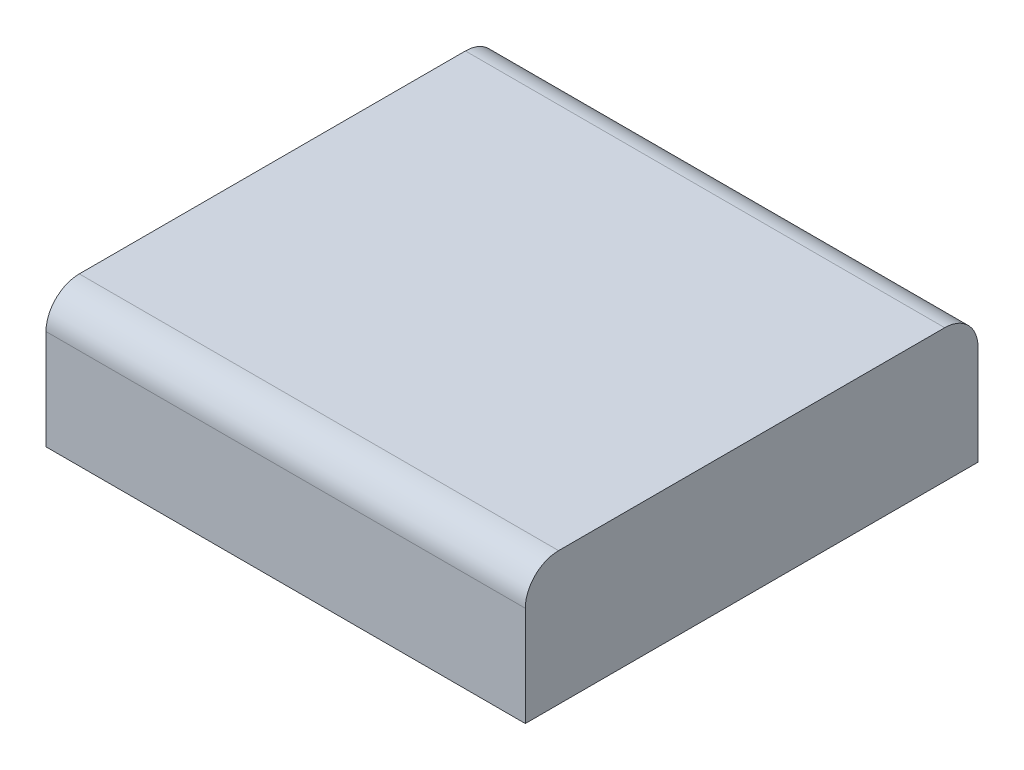
ISO-10303-21;
HEADER;
FILE_DESCRIPTION(('STEP AP214'),'2;1');
FILE_NAME('part.step','',(''),(''),'','','');
FILE_SCHEMA(('AUTOMOTIVE_DESIGN { 1 0 10303 214 1 1 1 1 }'));
ENDSEC;
DATA;
#1=APPLICATION_CONTEXT('core data for automotive mechanical design processes');
#2=APPLICATION_PROTOCOL_DEFINITION('international standard','automotive_design',2000,#1);
#3=PRODUCT_CONTEXT('',#1,'mechanical');
#4=PRODUCT('Part','Part','',(#3));
#5=PRODUCT_RELATED_PRODUCT_CATEGORY('part','',(#4));
#6=PRODUCT_DEFINITION_FORMATION('','',#4);
#7=PRODUCT_DEFINITION_CONTEXT('part definition',#1,'design');
#8=PRODUCT_DEFINITION('design','',#6,#7);
#9=PRODUCT_DEFINITION_SHAPE('','',#8);
#10=(LENGTH_UNIT() NAMED_UNIT(*) SI_UNIT(.MILLI.,.METRE.));
#11=(NAMED_UNIT(*) PLANE_ANGLE_UNIT() SI_UNIT($,.RADIAN.));
#12=(NAMED_UNIT(*) SI_UNIT($,.STERADIAN.) SOLID_ANGLE_UNIT());
#13=UNCERTAINTY_MEASURE_WITH_UNIT(LENGTH_MEASURE(1.E-05),#10,'distance_accuracy_value','');
#14=(GEOMETRIC_REPRESENTATION_CONTEXT(3) GLOBAL_UNCERTAINTY_ASSIGNED_CONTEXT((#13)) GLOBAL_UNIT_ASSIGNED_CONTEXT((#10,
#11,#12)) REPRESENTATION_CONTEXT('',''));
#15=CARTESIAN_POINT('',(0.,0.,0.));
#16=DIRECTION('',(0.,0.,1.));
#17=DIRECTION('',(1.,0.,0.));
#18=AXIS2_PLACEMENT_3D('',#15,#16,#17);
#19=CARTESIAN_POINT('',(17.,-5.,34.));
#20=DIRECTION('',(-1.,0.,0.));
#21=DIRECTION('',(0.,0.,1.));
#22=AXIS2_PLACEMENT_3D('',#19,#20,#21);
#23=PLANE('',#22);
#24=DIRECTION('',(0.,0.,1.));
#25=VECTOR('',#24,1.);
#26=CARTESIAN_POINT('',(17.,-3.59856596328812,34.));
#27=LINE('',#26,#25);
#28=CARTESIAN_POINT('',(17.,-3.59856596328812,22.7934089247413));
#29=VERTEX_POINT('',#28);
#30=CARTESIAN_POINT('',(17.,-3.59856596328812,30.8818924935145));
#31=VERTEX_POINT('',#30);
#32=EDGE_CURVE('E549',#29,#31,#27,.T.);
#33=ORIENTED_EDGE('',*,*,#32,.T.);
#34=DIRECTION('',(0.,-1.,0.));
#35=VECTOR('',#34,1.);
#36=CARTESIAN_POINT('',(17.,-5.,30.8818924935145));
#37=LINE('',#36,#35);
#38=CARTESIAN_POINT('',(17.,-5.,30.8818924935145));
#39=VERTEX_POINT('',#38);
#40=EDGE_CURVE('E293',#31,#39,#37,.T.);
#41=ORIENTED_EDGE('',*,*,#40,.T.);
#42=DIRECTION('',(0.,0.,-1.));
#43=VECTOR('',#42,1.);
#44=CARTESIAN_POINT('',(17.,-5.,34.));
#45=LINE('',#44,#43);
#46=CARTESIAN_POINT('',(17.,-5.,33.));
#47=VERTEX_POINT('',#46);
#48=EDGE_CURVE('E452',#47,#39,#45,.T.);
#49=ORIENTED_EDGE('',*,*,#48,.F.);
#50=DIRECTION('',(0.,1.,0.));
#51=VECTOR('',#50,1.);
#52=CARTESIAN_POINT('',(17.,-5.,33.));
#53=LINE('',#52,#51);
#54=CARTESIAN_POINT('',(17.,4.,33.));
#55=VERTEX_POINT('',#54);
#56=EDGE_CURVE('E429',#47,#55,#53,.T.);
#57=ORIENTED_EDGE('',*,*,#56,.T.);
#58=DIRECTION('',(0.,0.,-1.));
#59=VECTOR('',#58,1.);
#60=CARTESIAN_POINT('',(17.,4.,34.));
#61=LINE('',#60,#59);
#62=CARTESIAN_POINT('',(17.,4.,28.926894451086));
#63=VERTEX_POINT('',#62);
#64=EDGE_CURVE('E431',#55,#63,#61,.T.);
#65=ORIENTED_EDGE('',*,*,#64,.T.);
#66=DIRECTION('',(0.,-1.,0.));
#67=VECTOR('',#66,1.);
#68=CARTESIAN_POINT('',(17.,-5.,28.926894451086));
#69=LINE('',#68,#67);
#70=CARTESIAN_POINT('',(17.,-1.05643277440728,28.926894451086));
#71=VERTEX_POINT('',#70);
#72=EDGE_CURVE('E490',#63,#71,#69,.T.);
#73=ORIENTED_EDGE('',*,*,#72,.T.);
#74=DIRECTION('',(0.,0.,-1.));
#75=VECTOR('',#74,1.);
#76=CARTESIAN_POINT('',(17.,-1.05643277440728,34.));
#77=LINE('',#76,#75);
#78=CARTESIAN_POINT('',(17.,-1.05643277440728,4.95785802597595));
#79=VERTEX_POINT('',#78);
#80=EDGE_CURVE('E487',#71,#79,#77,.T.);
#81=ORIENTED_EDGE('',*,*,#80,.T.);
#82=DIRECTION('',(0.,1.,0.));
#83=VECTOR('',#82,1.);
#84=CARTESIAN_POINT('',(17.,-5.,4.95785802597595));
#85=LINE('',#84,#83);
#86=CARTESIAN_POINT('',(17.,4.,4.95785802597595));
#87=VERTEX_POINT('',#86);
#88=EDGE_CURVE('E477',#79,#87,#85,.T.);
#89=ORIENTED_EDGE('',*,*,#88,.T.);
#90=CARTESIAN_POINT('',(17.,4.,1.));
#91=VERTEX_POINT('',#90);
#92=EDGE_CURVE('E435',#87,#91,#61,.T.);
#93=ORIENTED_EDGE('',*,*,#92,.T.);
#94=DIRECTION('',(0.,1.,0.));
#95=VECTOR('',#94,1.);
#96=CARTESIAN_POINT('',(17.,-5.,1.));
#97=LINE('',#96,#95);
#98=CARTESIAN_POINT('',(17.,-5.,1.));
#99=VERTEX_POINT('',#98);
#100=EDGE_CURVE('E420',#99,#91,#97,.T.);
#101=ORIENTED_EDGE('',*,*,#100,.F.);
#102=CARTESIAN_POINT('',(17.,-5.,22.7934089247413));
#103=VERTEX_POINT('',#102);
#104=EDGE_CURVE('E434',#103,#99,#45,.T.);
#105=ORIENTED_EDGE('',*,*,#104,.F.);
#106=DIRECTION('',(0.,1.,0.));
#107=VECTOR('',#106,1.);
#108=CARTESIAN_POINT('',(17.,-5.,22.7934089247413));
#109=LINE('',#108,#107);
#110=EDGE_CURVE('E289',#103,#29,#109,.T.);
#111=ORIENTED_EDGE('',*,*,#110,.T.);
#112=EDGE_LOOP('',(#33,#41,#49,#57,#65,#73,#81,#89,#93,#101,#105,#111));
#113=FACE_BOUND('',#112,.T.);
#114=ADVANCED_FACE('F39',(#113),#23,.T.);
#115=CARTESIAN_POINT('',(-18.,-5.,34.));
#116=DIRECTION('',(0.,1.,0.));
#117=DIRECTION('',(0.,0.,1.));
#118=AXIS2_PLACEMENT_3D('',#115,#116,#117);
#119=PLANE('',#118);
#120=DIRECTION('',(1.,0.,0.));
#121=VECTOR('',#120,1.);
#122=CARTESIAN_POINT('',(-18.,-5.,0.));
#123=LINE('',#122,#121);
#124=CARTESIAN_POINT('',(-18.,-5.,0.));
#125=VERTEX_POINT('',#124);
#126=CARTESIAN_POINT('',(18.,-5.,0.));
#127=VERTEX_POINT('',#126);
#128=EDGE_CURVE('E470',#125,#127,#123,.T.);
#129=ORIENTED_EDGE('',*,*,#128,.T.);
#130=DIRECTION('',(0.,0.,-1.));
#131=VECTOR('',#130,1.);
#132=CARTESIAN_POINT('',(18.,-5.,34.));
#133=LINE('',#132,#131);
#134=CARTESIAN_POINT('',(18.,-5.,34.));
#135=VERTEX_POINT('',#134);
#136=EDGE_CURVE('E480',#135,#127,#133,.T.);
#137=ORIENTED_EDGE('',*,*,#136,.F.);
#138=DIRECTION('',(1.,0.,0.));
#139=VECTOR('',#138,1.);
#140=CARTESIAN_POINT('',(-18.,-5.,34.));
#141=LINE('',#140,#139);
#142=CARTESIAN_POINT('',(-18.,-5.,34.));
#143=VERTEX_POINT('',#142);
#144=EDGE_CURVE('E461',#143,#135,#141,.T.);
#145=ORIENTED_EDGE('',*,*,#144,.F.);
#146=DIRECTION('',(0.,0.,-1.));
#147=VECTOR('',#146,1.);
#148=CARTESIAN_POINT('',(-18.,-5.,34.));
#149=LINE('',#148,#147);
#150=EDGE_CURVE('E478',#143,#125,#149,.T.);
#151=ORIENTED_EDGE('',*,*,#150,.T.);
#152=EDGE_LOOP('',(#129,#137,#145,#151));
#153=FACE_BOUND('',#152,.T.);
#154=DIRECTION('',(-1.,0.,0.));
#155=VECTOR('',#154,1.);
#156=CARTESIAN_POINT('',(-18.,-5.,30.8818924935145));
#157=LINE('',#156,#155);
#158=CARTESIAN_POINT('',(17.5,-5.,30.8818924935145));
#159=VERTEX_POINT('',#158);
#160=EDGE_CURVE('E11',#159,#39,#157,.T.);
#161=ORIENTED_EDGE('',*,*,#160,.F.);
#162=DIRECTION('',(0.,0.,-1.));
#163=VECTOR('',#162,1.);
#164=CARTESIAN_POINT('',(17.5,-5.,34.));
#165=LINE('',#164,#163);
#166=CARTESIAN_POINT('',(17.5,-5.,22.7934089247413));
#167=VERTEX_POINT('',#166);
#168=EDGE_CURVE('E276',#159,#167,#165,.T.);
#169=ORIENTED_EDGE('',*,*,#168,.T.);
#170=DIRECTION('',(1.,0.,0.));
#171=VECTOR('',#170,1.);
#172=CARTESIAN_POINT('',(-18.,-5.,22.7934089247413));
#173=LINE('',#172,#171);
#174=EDGE_CURVE('E47',#103,#167,#173,.T.);
#175=ORIENTED_EDGE('',*,*,#174,.F.);
#176=ORIENTED_EDGE('',*,*,#104,.T.);
#177=DIRECTION('',(1.,0.,0.));
#178=VECTOR('',#177,1.);
#179=CARTESIAN_POINT('',(-18.,-5.,1.));
#180=LINE('',#179,#178);
#181=CARTESIAN_POINT('',(-0.0461280866638075,-5.,1.));
#182=VERTEX_POINT('',#181);
#183=EDGE_CURVE('E449',#182,#99,#180,.T.);
#184=ORIENTED_EDGE('',*,*,#183,.F.);
#185=DIRECTION('',(-0.78437618023216,0.,0.620285424530035));
#186=VECTOR('',#185,1.);
#187=CARTESIAN_POINT('',(-1.2576755346504,-5.,1.95809286672909));
#188=LINE('',#187,#186);
#189=CARTESIAN_POINT('',(-1.2576755346504,-5.,1.95809286672909));
#190=VERTEX_POINT('',#189);
#191=EDGE_CURVE('E297',#182,#190,#188,.T.);
#192=ORIENTED_EDGE('',*,*,#191,.T.);
#193=DIRECTION('',(-1.,0.,0.));
#194=VECTOR('',#193,1.);
#195=CARTESIAN_POINT('',(-2.2990755346504,-5.,1.95809286672909));
#196=LINE('',#195,#194);
#197=CARTESIAN_POINT('',(-2.2990755346504,-5.,1.95809286672909));
#198=VERTEX_POINT('',#197);
#199=EDGE_CURVE('E294',#190,#198,#196,.T.);
#200=ORIENTED_EDGE('',*,*,#199,.T.);
#201=DIRECTION('',(-0.68997566103992,0.,-0.723832568466303));
#202=VECTOR('',#201,1.);
#203=CARTESIAN_POINT('',(-3.2123540853237,-5.,0.999999999999999));
#204=LINE('',#203,#202);
#205=CARTESIAN_POINT('',(-3.2123540853237,-5.,1.));
#206=VERTEX_POINT('',#205);
#207=EDGE_CURVE('E304',#198,#206,#204,.T.);
#208=ORIENTED_EDGE('',*,*,#207,.T.);
#209=CARTESIAN_POINT('',(-17.,-5.,1.));
#210=VERTEX_POINT('',#209);
#211=EDGE_CURVE('E439',#210,#206,#180,.T.);
#212=ORIENTED_EDGE('',*,*,#211,.F.);
#213=DIRECTION('',(0.,0.,-1.));
#214=VECTOR('',#213,1.);
#215=CARTESIAN_POINT('',(-17.,-5.,34.));
#216=LINE('',#215,#214);
#217=CARTESIAN_POINT('',(-17.,-5.,33.));
#218=VERTEX_POINT('',#217);
#219=EDGE_CURVE('E450',#218,#210,#216,.T.);
#220=ORIENTED_EDGE('',*,*,#219,.F.);
#221=DIRECTION('',(1.,0.,0.));
#222=VECTOR('',#221,1.);
#223=CARTESIAN_POINT('',(-18.,-5.,33.));
#224=LINE('',#223,#222);
#225=CARTESIAN_POINT('',(7.80627689891057,-5.,33.));
#226=VERTEX_POINT('',#225);
#227=EDGE_CURVE('E443',#218,#226,#224,.T.);
#228=ORIENTED_EDGE('',*,*,#227,.T.);
#229=DIRECTION('',(0.707040858821482,0.,-0.707172697406356));
#230=VECTOR('',#229,1.);
#231=CARTESIAN_POINT('',(7.80627689891058,-5.,33.));
#232=LINE('',#231,#230);
#233=CARTESIAN_POINT('',(8.86878502896893,-5.,31.9372937490459));
#234=VERTEX_POINT('',#233);
#235=EDGE_CURVE('E318',#226,#234,#232,.T.);
#236=ORIENTED_EDGE('',*,*,#235,.T.);
#237=DIRECTION('',(1.,0.,0.));
#238=VECTOR('',#237,1.);
#239=CARTESIAN_POINT('',(8.86878502896893,-5.,31.9372937490459));
#240=LINE('',#239,#238);
#241=CARTESIAN_POINT('',(11.5237850289689,-5.,31.9372937490459));
#242=VERTEX_POINT('',#241);
#243=EDGE_CURVE('E314',#234,#242,#240,.T.);
#244=ORIENTED_EDGE('',*,*,#243,.T.);
#245=DIRECTION('',(0.,0.,1.));
#246=VECTOR('',#245,1.);
#247=CARTESIAN_POINT('',(11.5237850289689,-5.,31.9372937490459));
#248=LINE('',#247,#246);
#249=CARTESIAN_POINT('',(11.5237850289689,-5.,33.));
#250=VERTEX_POINT('',#249);
#251=EDGE_CURVE('E321',#242,#250,#248,.T.);
#252=ORIENTED_EDGE('',*,*,#251,.T.);
#253=EDGE_CURVE('E446',#250,#47,#224,.T.);
#254=ORIENTED_EDGE('',*,*,#253,.T.);
#255=ORIENTED_EDGE('',*,*,#48,.T.);
#256=EDGE_LOOP('',(#161,#169,#175,#176,#184,#192,#200,#208,#212,#220,#228,#236,#244,#252,#254,#255));
#257=FACE_BOUND('',#256,.T.);
#258=ADVANCED_FACE('F545',(#153,#257),#119,.F.);
#259=CARTESIAN_POINT('',(0.,0.,1.));
#260=DIRECTION('',(0.,0.,1.));
#261=DIRECTION('',(1.,0.,0.));
#262=AXIS2_PLACEMENT_3D('',#259,#260,#261);
#263=PLANE('',#262);
#264=ORIENTED_EDGE('',*,*,#211,.T.);
#265=DIRECTION('',(0.,-1.,0.));
#266=VECTOR('',#265,1.);
#267=CARTESIAN_POINT('',(-3.2123540853237,7.86642099012341,0.999999999999999));
#268=LINE('',#267,#266);
#269=CARTESIAN_POINT('',(-3.2123540853237,-3.2,1.));
#270=VERTEX_POINT('',#269);
#271=EDGE_CURVE('E307',#270,#206,#268,.T.);
#272=ORIENTED_EDGE('',*,*,#271,.F.);
#273=DIRECTION('',(-1.,0.,0.));
#274=VECTOR('',#273,1.);
#275=CARTESIAN_POINT('',(0.,-3.2,1.));
#276=LINE('',#275,#274);
#277=CARTESIAN_POINT('',(-5.64547851523037,-3.2,1.));
#278=VERTEX_POINT('',#277);
#279=EDGE_CURVE('E503',#270,#278,#276,.T.);
#280=ORIENTED_EDGE('',*,*,#279,.T.);
#281=DIRECTION('',(0.,-1.,0.));
#282=VECTOR('',#281,1.);
#283=CARTESIAN_POINT('',(-5.64547851523037,0.,1.));
#284=LINE('',#283,#282);
#285=CARTESIAN_POINT('',(-5.64547851523037,4.,1.));
#286=VERTEX_POINT('',#285);
#287=EDGE_CURVE('E506',#286,#278,#284,.T.);
#288=ORIENTED_EDGE('',*,*,#287,.F.);
#289=DIRECTION('',(1.,0.,0.));
#290=VECTOR('',#289,1.);
#291=CARTESIAN_POINT('',(-18.,4.,1.));
#292=LINE('',#291,#290);
#293=CARTESIAN_POINT('',(-17.,4.,1.));
#294=VERTEX_POINT('',#293);
#295=EDGE_CURVE('E417',#294,#286,#292,.T.);
#296=ORIENTED_EDGE('',*,*,#295,.F.);
#297=DIRECTION('',(0.,1.,0.));
#298=VECTOR('',#297,1.);
#299=CARTESIAN_POINT('',(-17.,-5.,1.));
#300=LINE('',#299,#298);
#301=EDGE_CURVE('E436',#210,#294,#300,.T.);
#302=ORIENTED_EDGE('',*,*,#301,.F.);
#303=EDGE_LOOP('',(#264,#272,#280,#288,#296,#302));
#304=FACE_BOUND('',#303,.T.);
#305=ADVANCED_FACE('F580',(#304),#263,.T.);
#306=CARTESIAN_POINT('',(2.52238131463829,-3.2,1.));
#307=VERTEX_POINT('',#306);
#308=CARTESIAN_POINT('',(-0.0461280866638077,-3.2,1.));
#309=VERTEX_POINT('',#308);
#310=EDGE_CURVE('E504',#307,#309,#276,.T.);
#311=ORIENTED_EDGE('',*,*,#310,.T.);
#312=DIRECTION('',(0.,-1.,0.));
#313=VECTOR('',#312,1.);
#314=CARTESIAN_POINT('',(-0.0461280866638075,7.86642099012341,1.));
#315=LINE('',#314,#313);
#316=EDGE_CURVE('E62',#309,#182,#315,.T.);
#317=ORIENTED_EDGE('',*,*,#316,.T.);
#318=ORIENTED_EDGE('',*,*,#183,.T.);
#319=ORIENTED_EDGE('',*,*,#100,.T.);
#320=CARTESIAN_POINT('',(2.52238131463829,4.,1.));
#321=VERTEX_POINT('',#320);
#322=EDGE_CURVE('E416',#321,#91,#292,.T.);
#323=ORIENTED_EDGE('',*,*,#322,.F.);
#324=DIRECTION('',(0.,1.,0.));
#325=VECTOR('',#324,1.);
#326=CARTESIAN_POINT('',(2.52238131463829,0.,1.));
#327=LINE('',#326,#325);
#328=EDGE_CURVE('E509',#307,#321,#327,.T.);
#329=ORIENTED_EDGE('',*,*,#328,.F.);
#330=EDGE_LOOP('',(#311,#317,#318,#319,#323,#329));
#331=FACE_BOUND('',#330,.T.);
#332=ADVANCED_FACE('F556',(#331),#263,.T.);
#333=CARTESIAN_POINT('',(0.,-3.2,0.));
#334=DIRECTION('',(0.,1.,0.));
#335=DIRECTION('',(0.,0.,1.));
#336=AXIS2_PLACEMENT_3D('',#333,#334,#335);
#337=PLANE('',#336);
#338=DIRECTION('',(-0.68997566103992,0.,-0.723832568466303));
#339=VECTOR('',#338,1.);
#340=CARTESIAN_POINT('',(-2.18248705410172,-3.2,2.08040231051721));
#341=LINE('',#340,#339);
#342=CARTESIAN_POINT('',(-2.2990755346504,-3.2,1.95809286672909));
#343=VERTEX_POINT('',#342);
#344=EDGE_CURVE('E536',#343,#270,#341,.T.);
#345=ORIENTED_EDGE('',*,*,#344,.F.);
#346=DIRECTION('',(-1.,0.,0.));
#347=VECTOR('',#346,1.);
#348=CARTESIAN_POINT('',(0.,-3.2,1.95809286672909));
#349=LINE('',#348,#347);
#350=CARTESIAN_POINT('',(-1.2576755346504,-3.2,1.95809286672909));
#351=VERTEX_POINT('',#350);
#352=EDGE_CURVE('E533',#351,#343,#349,.T.);
#353=ORIENTED_EDGE('',*,*,#352,.F.);
#354=DIRECTION('',(-0.78437618023216,0.,0.620285424530035));
#355=VECTOR('',#354,1.);
#356=CARTESIAN_POINT('',(0.468789145726614,-3.2,0.592802966050565));
#357=LINE('',#356,#355);
#358=EDGE_CURVE('E530',#309,#351,#357,.T.);
#359=ORIENTED_EDGE('',*,*,#358,.F.);
#360=ORIENTED_EDGE('',*,*,#310,.F.);
#361=DIRECTION('',(0.756635368845266,0.,-0.653837073445968));
#362=VECTOR('',#361,1.);
#363=CARTESIAN_POINT('',(2.54458171045212,-3.2,0.980815803191426));
#364=LINE('',#363,#362);
#365=CARTESIAN_POINT('',(-0.105019187153202,-3.2,3.27043556988826));
#366=VERTEX_POINT('',#365);
#367=EDGE_CURVE('E357',#366,#307,#364,.T.);
#368=ORIENTED_EDGE('',*,*,#367,.F.);
#369=DIRECTION('',(1.,0.,0.));
#370=VECTOR('',#369,1.);
#371=CARTESIAN_POINT('',(-0.105019187153202,-3.2,3.27043556988826));
#372=LINE('',#371,#370);
#373=CARTESIAN_POINT('',(-3.68350976570056,-3.2,3.27043556988826));
#374=VERTEX_POINT('',#373);
#375=EDGE_CURVE('E354',#374,#366,#372,.T.);
#376=ORIENTED_EDGE('',*,*,#375,.F.);
#377=DIRECTION('',(0.653837073445968,0.,0.756635368845266));
#378=VECTOR('',#377,1.);
#379=CARTESIAN_POINT('',(-3.68350976570056,-3.2,3.27043556988826));
#380=LINE('',#379,#378);
#381=EDGE_CURVE('E347',#278,#374,#380,.T.);
#382=ORIENTED_EDGE('',*,*,#381,.F.);
#383=ORIENTED_EDGE('',*,*,#279,.F.);
#384=EDGE_LOOP('',(#345,#353,#359,#360,#368,#376,#382,#383));
#385=FACE_BOUND('',#384,.T.);
#386=ADVANCED_FACE('F590',(#385),#337,.F.);
#387=CARTESIAN_POINT('',(-18.,4.,34.));
#388=DIRECTION('',(0.,1.,0.));
#389=DIRECTION('',(0.,0.,1.));
#390=AXIS2_PLACEMENT_3D('',#387,#388,#389);
#391=PLANE('',#390);
#392=DIRECTION('',(0.,0.,-1.));
#393=VECTOR('',#392,1.);
#394=CARTESIAN_POINT('',(11.5237850289689,4.,31.9372937490459));
#395=LINE('',#394,#393);
#396=CARTESIAN_POINT('',(11.5237850289689,4.,33.));
#397=VERTEX_POINT('',#396);
#398=CARTESIAN_POINT('',(11.5237850289689,4.,32.9683062998148));
#399=VERTEX_POINT('',#398);
#400=EDGE_CURVE('E325',#397,#399,#395,.T.);
#401=ORIENTED_EDGE('',*,*,#400,.T.);
#402=DIRECTION('',(-1.,0.,0.));
#403=VECTOR('',#402,1.);
#404=CARTESIAN_POINT('',(13.9400122350262,4.,32.9683062998148));
#405=LINE('',#404,#403);
#406=CARTESIAN_POINT('',(13.9400122350262,4.,32.9683062998148));
#407=VERTEX_POINT('',#406);
#408=EDGE_CURVE('E365',#407,#399,#405,.T.);
#409=ORIENTED_EDGE('',*,*,#408,.F.);
#410=DIRECTION('',(0.,0.,1.));
#411=VECTOR('',#410,1.);
#412=CARTESIAN_POINT('',(13.9400122350262,4.,30.2455364866692));
#413=LINE('',#412,#411);
#414=CARTESIAN_POINT('',(13.9400122350262,4.,30.2455364866692));
#415=VERTEX_POINT('',#414);
#416=EDGE_CURVE('E369',#415,#407,#413,.T.);
#417=ORIENTED_EDGE('',*,*,#416,.F.);
#418=DIRECTION('',(1.,0.,0.));
#419=VECTOR('',#418,1.);
#420=CARTESIAN_POINT('',(12.3591776077276,4.,30.2455364866692));
#421=LINE('',#420,#419);
#422=CARTESIAN_POINT('',(7.40340874838499,4.,30.2455364866692));
#423=VERTEX_POINT('',#422);
#424=EDGE_CURVE('E373',#423,#415,#421,.T.);
#425=ORIENTED_EDGE('',*,*,#424,.F.);
#426=DIRECTION('',(0.68267317744641,0.,-0.73072384167702));
#427=VECTOR('',#426,1.);
#428=CARTESIAN_POINT('',(4.85968181109299,4.,32.9683062998148));
#429=LINE('',#428,#427);
#430=CARTESIAN_POINT('',(4.85968181109299,4.,32.9683062998148));
#431=VERTEX_POINT('',#430);
#432=EDGE_CURVE('E368',#431,#423,#429,.T.);
#433=ORIENTED_EDGE('',*,*,#432,.F.);
#434=CARTESIAN_POINT('',(7.83796469042223,4.,32.9683062998148));
#435=VERTEX_POINT('',#434);
#436=EDGE_CURVE('E363',#435,#431,#405,.T.);
#437=ORIENTED_EDGE('',*,*,#436,.F.);
#438=DIRECTION('',(-0.707040858821482,0.,0.707172697406356));
#439=VECTOR('',#438,1.);
#440=CARTESIAN_POINT('',(7.80627689891058,4.,33.));
#441=LINE('',#440,#439);
#442=CARTESIAN_POINT('',(7.80627689891057,4.,33.));
#443=VERTEX_POINT('',#442);
#444=EDGE_CURVE('E329',#435,#443,#441,.T.);
#445=ORIENTED_EDGE('',*,*,#444,.T.);
#446=DIRECTION('',(1.,0.,0.));
#447=VECTOR('',#446,1.);
#448=CARTESIAN_POINT('',(-18.,4.,33.));
#449=LINE('',#448,#447);
#450=CARTESIAN_POINT('',(-17.,4.,33.));
#451=VERTEX_POINT('',#450);
#452=EDGE_CURVE('E426',#451,#443,#449,.T.);
#453=ORIENTED_EDGE('',*,*,#452,.F.);
#454=DIRECTION('',(0.,0.,-1.));
#455=VECTOR('',#454,1.);
#456=CARTESIAN_POINT('',(-17.,4.,34.));
#457=LINE('',#456,#455);
#458=CARTESIAN_POINT('',(-17.,4.,28.926894451086));
#459=VERTEX_POINT('',#458);
#460=EDGE_CURVE('E421',#451,#459,#457,.T.);
#461=ORIENTED_EDGE('',*,*,#460,.T.);
#462=DIRECTION('',(-1.,0.,0.));
#463=VECTOR('',#462,1.);
#464=CARTESIAN_POINT('',(-18.,4.,28.926894451086));
#465=LINE('',#464,#463);
#466=EDGE_CURVE('E410',#63,#459,#465,.T.);
#467=ORIENTED_EDGE('',*,*,#466,.F.);
#468=ORIENTED_EDGE('',*,*,#64,.F.);
#469=EDGE_CURVE('E430',#397,#55,#449,.T.);
#470=ORIENTED_EDGE('',*,*,#469,.F.);
#471=EDGE_LOOP('',(#401,#409,#417,#425,#433,#437,#445,#453,#461,#467,#468,#470));
#472=FACE_BOUND('',#471,.T.);
#473=ADVANCED_FACE('F634',(#472),#391,.F.);
#474=CARTESIAN_POINT('',(0.,0.,33.));
#475=DIRECTION('',(0.,0.,1.));
#476=DIRECTION('',(1.,0.,0.));
#477=AXIS2_PLACEMENT_3D('',#474,#475,#476);
#478=PLANE('',#477);
#479=DIRECTION('',(0.,-1.,0.));
#480=VECTOR('',#479,1.);
#481=CARTESIAN_POINT('',(11.5237850289689,7.86642099012341,33.));
#482=LINE('',#481,#480);
#483=EDGE_CURVE('E333',#397,#250,#482,.T.);
#484=ORIENTED_EDGE('',*,*,#483,.F.);
#485=ORIENTED_EDGE('',*,*,#469,.T.);
#486=ORIENTED_EDGE('',*,*,#56,.F.);
#487=ORIENTED_EDGE('',*,*,#253,.F.);
#488=EDGE_LOOP('',(#484,#485,#486,#487));
#489=FACE_BOUND('',#488,.T.);
#490=ADVANCED_FACE('F630',(#489),#478,.F.);
#491=DIRECTION('',(0.,-1.,0.));
#492=VECTOR('',#491,1.);
#493=CARTESIAN_POINT('',(7.80627689891058,7.86642099012341,33.));
#494=LINE('',#493,#492);
#495=EDGE_CURVE('E324',#443,#226,#494,.T.);
#496=ORIENTED_EDGE('',*,*,#495,.T.);
#497=ORIENTED_EDGE('',*,*,#227,.F.);
#498=DIRECTION('',(0.,1.,0.));
#499=VECTOR('',#498,1.);
#500=CARTESIAN_POINT('',(-17.,-5.,33.));
#501=LINE('',#500,#499);
#502=EDGE_CURVE('E440',#218,#451,#501,.T.);
#503=ORIENTED_EDGE('',*,*,#502,.T.);
#504=ORIENTED_EDGE('',*,*,#452,.T.);
#505=EDGE_LOOP('',(#496,#497,#503,#504));
#506=FACE_BOUND('',#505,.T.);
#507=ADVANCED_FACE('F633',(#506),#478,.F.);
#508=CARTESIAN_POINT('',(13.9400122350262,-3.2,32.9683062998148));
#509=DIRECTION('',(0.,0.,-1.));
#510=DIRECTION('',(-1.,0.,0.));
#511=AXIS2_PLACEMENT_3D('',#508,#509,#510);
#512=PLANE('',#511);
#513=DIRECTION('',(0.,1.,0.));
#514=VECTOR('',#513,1.);
#515=CARTESIAN_POINT('',(11.5237850289689,-3.2,32.9683062998148));
#516=LINE('',#515,#514);
#517=CARTESIAN_POINT('',(11.5237850289689,-3.2,32.9683062998148));
#518=VERTEX_POINT('',#517);
#519=EDGE_CURVE('E341',#518,#399,#516,.T.);
#520=ORIENTED_EDGE('',*,*,#519,.F.);
#521=DIRECTION('',(-1.,0.,0.));
#522=VECTOR('',#521,1.);
#523=CARTESIAN_POINT('',(13.9400122350262,-3.2,32.9683062998148));
#524=LINE('',#523,#522);
#525=CARTESIAN_POINT('',(13.9400122350262,-3.2,32.9683062998148));
#526=VERTEX_POINT('',#525);
#527=EDGE_CURVE('E381',#526,#518,#524,.T.);
#528=ORIENTED_EDGE('',*,*,#527,.F.);
#529=DIRECTION('',(0.,1.,0.));
#530=VECTOR('',#529,1.);
#531=CARTESIAN_POINT('',(13.9400122350262,-3.2,32.9683062998148));
#532=LINE('',#531,#530);
#533=EDGE_CURVE('E397',#526,#407,#532,.T.);
#534=ORIENTED_EDGE('',*,*,#533,.T.);
#535=ORIENTED_EDGE('',*,*,#408,.T.);
#536=EDGE_LOOP('',(#520,#528,#534,#535));
#537=FACE_BOUND('',#536,.T.);
#538=ADVANCED_FACE('F687',(#537),#512,.F.);
#539=DIRECTION('',(0.,-1.,0.));
#540=VECTOR('',#539,1.);
#541=CARTESIAN_POINT('',(7.83796469042223,-3.2,32.9683062998148));
#542=LINE('',#541,#540);
#543=CARTESIAN_POINT('',(7.83796469042222,-3.2,32.9683062998148));
#544=VERTEX_POINT('',#543);
#545=EDGE_CURVE('E328',#435,#544,#542,.T.);
#546=ORIENTED_EDGE('',*,*,#545,.F.);
#547=ORIENTED_EDGE('',*,*,#436,.T.);
#548=DIRECTION('',(0.,1.,0.));
#549=VECTOR('',#548,1.);
#550=CARTESIAN_POINT('',(4.85968181109299,-3.2,32.9683062998148));
#551=LINE('',#550,#549);
#552=CARTESIAN_POINT('',(4.85968181109299,-3.2,32.9683062998148));
#553=VERTEX_POINT('',#552);
#554=EDGE_CURVE('E394',#553,#431,#551,.T.);
#555=ORIENTED_EDGE('',*,*,#554,.F.);
#556=EDGE_CURVE('E380',#544,#553,#524,.T.);
#557=ORIENTED_EDGE('',*,*,#556,.F.);
#558=EDGE_LOOP('',(#546,#547,#555,#557));
#559=FACE_BOUND('',#558,.T.);
#560=ADVANCED_FACE('F682',(#559),#512,.F.);
#561=CARTESIAN_POINT('',(0.,-3.2,0.));
#562=DIRECTION('',(0.,-1.,0.));
#563=DIRECTION('',(0.,0.,-1.));
#564=AXIS2_PLACEMENT_3D('',#561,#562,#563);
#565=PLANE('',#564);
#566=ORIENTED_EDGE('',*,*,#527,.T.);
#567=DIRECTION('',(0.,0.,-1.));
#568=VECTOR('',#567,1.);
#569=CARTESIAN_POINT('',(11.5237850289689,-3.2,0.));
#570=LINE('',#569,#568);
#571=CARTESIAN_POINT('',(11.5237850289689,-3.2,31.9372937490459));
#572=VERTEX_POINT('',#571);
#573=EDGE_CURVE('E527',#518,#572,#570,.T.);
#574=ORIENTED_EDGE('',*,*,#573,.T.);
#575=DIRECTION('',(-1.,0.,0.));
#576=VECTOR('',#575,1.);
#577=CARTESIAN_POINT('',(0.,-3.2,31.9372937490459));
#578=LINE('',#577,#576);
#579=CARTESIAN_POINT('',(8.86878502896893,-3.2,31.9372937490459));
#580=VERTEX_POINT('',#579);
#581=EDGE_CURVE('E524',#572,#580,#578,.T.);
#582=ORIENTED_EDGE('',*,*,#581,.T.);
#583=DIRECTION('',(-0.707040858821482,0.,0.707172697406356));
#584=VECTOR('',#583,1.);
#585=CARTESIAN_POINT('',(20.4038658946838,-3.2,20.4000619910328));
#586=LINE('',#585,#584);
#587=EDGE_CURVE('E521',#580,#544,#586,.T.);
#588=ORIENTED_EDGE('',*,*,#587,.T.);
#589=ORIENTED_EDGE('',*,*,#556,.T.);
#590=DIRECTION('',(0.68267317744641,0.,-0.73072384167702));
#591=VECTOR('',#590,1.);
#592=CARTESIAN_POINT('',(4.85968181109299,-3.2,32.9683062998148));
#593=LINE('',#592,#591);
#594=CARTESIAN_POINT('',(7.40340874838498,-3.2,30.2455364866692));
#595=VERTEX_POINT('',#594);
#596=EDGE_CURVE('E384',#553,#595,#593,.T.);
#597=ORIENTED_EDGE('',*,*,#596,.T.);
#598=DIRECTION('',(1.,0.,0.));
#599=VECTOR('',#598,1.);
#600=CARTESIAN_POINT('',(7.40340874838498,-3.2,30.2455364866692));
#601=LINE('',#600,#599);
#602=CARTESIAN_POINT('',(13.9400122350262,-3.2,30.2455364866692));
#603=VERTEX_POINT('',#602);
#604=EDGE_CURVE('E386',#595,#603,#601,.T.);
#605=ORIENTED_EDGE('',*,*,#604,.T.);
#606=DIRECTION('',(0.,0.,1.));
#607=VECTOR('',#606,1.);
#608=CARTESIAN_POINT('',(13.9400122350262,-3.2,30.2455364866692));
#609=LINE('',#608,#607);
#610=EDGE_CURVE('E372',#603,#526,#609,.T.);
#611=ORIENTED_EDGE('',*,*,#610,.T.);
#612=EDGE_LOOP('',(#566,#574,#582,#588,#589,#597,#605,#611));
#613=FACE_BOUND('',#612,.T.);
#614=ADVANCED_FACE('F664',(#613),#565,.T.);
#615=CARTESIAN_POINT('',(-18.,2.5,2.5));
#616=DIRECTION('',(1.,0.,0.));
#617=DIRECTION('',(0.,0.,-1.));
#618=AXIS2_PLACEMENT_3D('',#615,#616,#617);
#619=CYLINDRICAL_SURFACE('',#618,2.5);
#620=DIRECTION('',(-1.,0.,0.));
#621=VECTOR('',#620,1.);
#622=CARTESIAN_POINT('',(-18.,5.,2.5));
#623=LINE('',#622,#621);
#624=CARTESIAN_POINT('',(18.,5.,2.5));
#625=VERTEX_POINT('',#624);
#626=CARTESIAN_POINT('',(-18.,5.,2.5));
#627=VERTEX_POINT('',#626);
#628=EDGE_CURVE('E511',#625,#627,#623,.T.);
#629=ORIENTED_EDGE('',*,*,#628,.F.);
#630=CARTESIAN_POINT('',(18.,2.5,2.5));
#631=DIRECTION('',(-1.,0.,0.));
#632=DIRECTION('',(0.,0.,1.));
#633=AXIS2_PLACEMENT_3D('',#630,#631,#632);
#634=CIRCLE('',#633,2.5);
#635=CARTESIAN_POINT('',(18.,2.5,0.));
#636=VERTEX_POINT('',#635);
#637=EDGE_CURVE('E517',#636,#625,#634,.F.);
#638=ORIENTED_EDGE('',*,*,#637,.F.);
#639=DIRECTION('',(-1.,0.,0.));
#640=VECTOR('',#639,1.);
#641=CARTESIAN_POINT('',(-18.,2.5,0.));
#642=LINE('',#641,#640);
#643=CARTESIAN_POINT('',(-18.,2.5,0.));
#644=VERTEX_POINT('',#643);
#645=EDGE_CURVE('E514',#644,#636,#642,.F.);
#646=ORIENTED_EDGE('',*,*,#645,.F.);
#647=CARTESIAN_POINT('',(-18.,2.5,2.5));
#648=DIRECTION('',(-1.,0.,0.));
#649=DIRECTION('',(0.,-1.,0.));
#650=AXIS2_PLACEMENT_3D('',#647,#648,#649);
#651=CIRCLE('',#650,2.5);
#652=EDGE_CURVE('E519',#627,#644,#651,.T.);
#653=ORIENTED_EDGE('',*,*,#652,.F.);
#654=EDGE_LOOP('',(#629,#638,#646,#653));
#655=FACE_BOUND('',#654,.T.);
#656=ADVANCED_FACE('F41',(#655),#619,.T.);
#657=CARTESIAN_POINT('',(-18.,2.5,31.5));
#658=DIRECTION('',(1.,0.,0.));
#659=DIRECTION('',(0.,0.,-1.));
#660=AXIS2_PLACEMENT_3D('',#657,#658,#659);
#661=CYLINDRICAL_SURFACE('',#660,2.5);
#662=DIRECTION('',(1.,0.,0.));
#663=VECTOR('',#662,1.);
#664=CARTESIAN_POINT('',(-18.,5.,31.5));
#665=LINE('',#664,#663);
#666=CARTESIAN_POINT('',(-18.,5.,31.5));
#667=VERTEX_POINT('',#666);
#668=CARTESIAN_POINT('',(18.,5.,31.5));
#669=VERTEX_POINT('',#668);
#670=EDGE_CURVE('E493',#667,#669,#665,.T.);
#671=ORIENTED_EDGE('',*,*,#670,.F.);
#672=CARTESIAN_POINT('',(-18.,2.5,31.5));
#673=DIRECTION('',(-1.,0.,0.));
#674=DIRECTION('',(0.,-1.,0.));
#675=AXIS2_PLACEMENT_3D('',#672,#673,#674);
#676=CIRCLE('',#675,2.5);
#677=CARTESIAN_POINT('',(-18.,2.5,34.));
#678=VERTEX_POINT('',#677);
#679=EDGE_CURVE('E499',#678,#667,#676,.T.);
#680=ORIENTED_EDGE('',*,*,#679,.F.);
#681=DIRECTION('',(1.,0.,0.));
#682=VECTOR('',#681,1.);
#683=CARTESIAN_POINT('',(0.,2.5,34.));
#684=LINE('',#683,#682);
#685=CARTESIAN_POINT('',(18.,2.5,34.));
#686=VERTEX_POINT('',#685);
#687=EDGE_CURVE('E496',#686,#678,#684,.F.);
#688=ORIENTED_EDGE('',*,*,#687,.F.);
#689=CARTESIAN_POINT('',(18.,2.5,31.5));
#690=DIRECTION('',(-1.,0.,0.));
#691=DIRECTION('',(0.,0.,1.));
#692=AXIS2_PLACEMENT_3D('',#689,#690,#691);
#693=CIRCLE('',#692,2.5);
#694=EDGE_CURVE('E501',#669,#686,#693,.F.);
#695=ORIENTED_EDGE('',*,*,#694,.F.);
#696=EDGE_LOOP('',(#671,#680,#688,#695));
#697=FACE_BOUND('',#696,.T.);
#698=ADVANCED_FACE('F657',(#697),#661,.T.);
#699=DIRECTION('',(1.,0.,0.));
#700=VECTOR('',#699,1.);
#701=CARTESIAN_POINT('',(-0.105019187153202,4.,3.27043556988826));
#702=LINE('',#701,#700);
#703=CARTESIAN_POINT('',(-3.68350976570056,4.,3.27043556988826));
#704=VERTEX_POINT('',#703);
#705=CARTESIAN_POINT('',(-0.105019187153202,4.,3.27043556988826));
#706=VERTEX_POINT('',#705);
#707=EDGE_CURVE('E344',#704,#706,#702,.T.);
#708=ORIENTED_EDGE('',*,*,#707,.T.);
#709=DIRECTION('',(0.756635368845266,0.,-0.653837073445968));
#710=VECTOR('',#709,1.);
#711=CARTESIAN_POINT('',(2.54458171045212,4.,0.980815803191426));
#712=LINE('',#711,#710);
#713=EDGE_CURVE('E343',#706,#321,#712,.T.);
#714=ORIENTED_EDGE('',*,*,#713,.T.);
#715=ORIENTED_EDGE('',*,*,#322,.T.);
#716=ORIENTED_EDGE('',*,*,#92,.F.);
#717=DIRECTION('',(1.,0.,0.));
#718=VECTOR('',#717,1.);
#719=CARTESIAN_POINT('',(-18.,4.,4.95785802597595));
#720=LINE('',#719,#718);
#721=CARTESIAN_POINT('',(-17.,4.,4.95785802597595));
#722=VERTEX_POINT('',#721);
#723=EDGE_CURVE('E406',#722,#87,#720,.T.);
#724=ORIENTED_EDGE('',*,*,#723,.F.);
#725=EDGE_CURVE('E425',#722,#294,#457,.T.);
#726=ORIENTED_EDGE('',*,*,#725,.T.);
#727=ORIENTED_EDGE('',*,*,#295,.T.);
#728=DIRECTION('',(0.653837073445968,0.,0.756635368845266));
#729=VECTOR('',#728,1.);
#730=CARTESIAN_POINT('',(-3.68350976570056,4.,3.27043556988826));
#731=LINE('',#730,#729);
#732=EDGE_CURVE('E348',#286,#704,#731,.T.);
#733=ORIENTED_EDGE('',*,*,#732,.T.);
#734=EDGE_LOOP('',(#708,#714,#715,#716,#724,#726,#727,#733));
#735=FACE_BOUND('',#734,.T.);
#736=ADVANCED_FACE('F561',(#735),#391,.F.);
#737=CARTESIAN_POINT('',(-17.,-5.,34.));
#738=DIRECTION('',(-1.,0.,0.));
#739=DIRECTION('',(0.,-1.,0.));
#740=AXIS2_PLACEMENT_3D('',#737,#738,#739);
#741=PLANE('',#740);
#742=DIRECTION('',(0.,-1.,0.));
#743=VECTOR('',#742,1.);
#744=CARTESIAN_POINT('',(-17.,-5.,28.926894451086));
#745=LINE('',#744,#743);
#746=CARTESIAN_POINT('',(-17.,-1.05643277440728,28.926894451086));
#747=VERTEX_POINT('',#746);
#748=EDGE_CURVE('E412',#459,#747,#745,.T.);
#749=ORIENTED_EDGE('',*,*,#748,.F.);
#750=ORIENTED_EDGE('',*,*,#460,.F.);
#751=ORIENTED_EDGE('',*,*,#502,.F.);
#752=ORIENTED_EDGE('',*,*,#219,.T.);
#753=ORIENTED_EDGE('',*,*,#301,.T.);
#754=ORIENTED_EDGE('',*,*,#725,.F.);
#755=DIRECTION('',(0.,1.,0.));
#756=VECTOR('',#755,1.);
#757=CARTESIAN_POINT('',(-17.,-5.,4.95785802597595));
#758=LINE('',#757,#756);
#759=CARTESIAN_POINT('',(-17.,-1.05643277440728,4.95785802597595));
#760=VERTEX_POINT('',#759);
#761=EDGE_CURVE('E408',#760,#722,#758,.T.);
#762=ORIENTED_EDGE('',*,*,#761,.F.);
#763=DIRECTION('',(0.,0.,-1.));
#764=VECTOR('',#763,1.);
#765=CARTESIAN_POINT('',(-17.,-1.05643277440728,34.));
#766=LINE('',#765,#764);
#767=EDGE_CURVE('E414',#747,#760,#766,.T.);
#768=ORIENTED_EDGE('',*,*,#767,.F.);
#769=EDGE_LOOP('',(#749,#750,#751,#752,#753,#754,#762,#768));
#770=FACE_BOUND('',#769,.T.);
#771=ADVANCED_FACE('F574',(#770),#741,.F.);
#772=CARTESIAN_POINT('',(-18.,5.,34.));
#773=DIRECTION('',(0.,1.,0.));
#774=DIRECTION('',(0.,0.,1.));
#775=AXIS2_PLACEMENT_3D('',#772,#773,#774);
#776=PLANE('',#775);
#777=DIRECTION('',(0.,0.,-1.));
#778=VECTOR('',#777,1.);
#779=CARTESIAN_POINT('',(18.,5.,34.));
#780=LINE('',#779,#778);
#781=EDGE_CURVE('E467',#669,#625,#780,.T.);
#782=ORIENTED_EDGE('',*,*,#781,.T.);
#783=ORIENTED_EDGE('',*,*,#628,.T.);
#784=DIRECTION('',(0.,0.,-1.));
#785=VECTOR('',#784,1.);
#786=CARTESIAN_POINT('',(-18.,5.,34.));
#787=LINE('',#786,#785);
#788=EDGE_CURVE('E474',#667,#627,#787,.T.);
#789=ORIENTED_EDGE('',*,*,#788,.F.);
#790=ORIENTED_EDGE('',*,*,#670,.T.);
#791=EDGE_LOOP('',(#782,#783,#789,#790));
#792=FACE_BOUND('',#791,.T.);
#793=ADVANCED_FACE('F649',(#792),#776,.T.);
#794=CARTESIAN_POINT('',(-18.,-5.,34.));
#795=DIRECTION('',(-1.,0.,0.));
#796=DIRECTION('',(0.,-1.,0.));
#797=AXIS2_PLACEMENT_3D('',#794,#795,#796);
#798=PLANE('',#797);
#799=ORIENTED_EDGE('',*,*,#788,.T.);
#800=ORIENTED_EDGE('',*,*,#652,.T.);
#801=DIRECTION('',(0.,1.,0.));
#802=VECTOR('',#801,1.);
#803=CARTESIAN_POINT('',(-18.,-5.,0.));
#804=LINE('',#803,#802);
#805=EDGE_CURVE('E462',#125,#644,#804,.T.);
#806=ORIENTED_EDGE('',*,*,#805,.F.);
#807=ORIENTED_EDGE('',*,*,#150,.F.);
#808=DIRECTION('',(0.,1.,0.));
#809=VECTOR('',#808,1.);
#810=CARTESIAN_POINT('',(-18.,-5.,34.));
#811=LINE('',#810,#809);
#812=EDGE_CURVE('E464',#143,#678,#811,.T.);
#813=ORIENTED_EDGE('',*,*,#812,.T.);
#814=ORIENTED_EDGE('',*,*,#679,.T.);
#815=EDGE_LOOP('',(#799,#800,#806,#807,#813,#814));
#816=FACE_BOUND('',#815,.T.);
#817=ADVANCED_FACE('F647',(#816),#798,.T.);
#818=CARTESIAN_POINT('',(18.,-5.,34.));
#819=DIRECTION('',(-1.,0.,0.));
#820=DIRECTION('',(0.,0.,1.));
#821=AXIS2_PLACEMENT_3D('',#818,#819,#820);
#822=PLANE('',#821);
#823=DIRECTION('',(0.,1.,0.));
#824=VECTOR('',#823,1.);
#825=CARTESIAN_POINT('',(18.,-5.,0.));
#826=LINE('',#825,#824);
#827=EDGE_CURVE('E424',#127,#636,#826,.T.);
#828=ORIENTED_EDGE('',*,*,#827,.T.);
#829=ORIENTED_EDGE('',*,*,#637,.T.);
#830=ORIENTED_EDGE('',*,*,#781,.F.);
#831=ORIENTED_EDGE('',*,*,#694,.T.);
#832=DIRECTION('',(0.,1.,0.));
#833=VECTOR('',#832,1.);
#834=CARTESIAN_POINT('',(18.,-5.,34.));
#835=LINE('',#834,#833);
#836=EDGE_CURVE('E458',#135,#686,#835,.T.);
#837=ORIENTED_EDGE('',*,*,#836,.F.);
#838=ORIENTED_EDGE('',*,*,#136,.T.);
#839=EDGE_LOOP('',(#828,#829,#830,#831,#837,#838));
#840=FACE_BOUND('',#839,.T.);
#841=ADVANCED_FACE('F642',(#840),#822,.F.);
#842=CARTESIAN_POINT('',(0.,0.,34.));
#843=DIRECTION('',(0.,0.,1.));
#844=DIRECTION('',(1.,0.,0.));
#845=AXIS2_PLACEMENT_3D('',#842,#843,#844);
#846=PLANE('',#845);
#847=ORIENTED_EDGE('',*,*,#836,.T.);
#848=ORIENTED_EDGE('',*,*,#687,.T.);
#849=ORIENTED_EDGE('',*,*,#812,.F.);
#850=ORIENTED_EDGE('',*,*,#144,.T.);
#851=EDGE_LOOP('',(#847,#848,#849,#850));
#852=FACE_BOUND('',#851,.T.);
#853=ADVANCED_FACE('F638',(#852),#846,.T.);
#854=CARTESIAN_POINT('',(0.,0.,0.));
#855=DIRECTION('',(0.,0.,1.));
#856=DIRECTION('',(1.,0.,0.));
#857=AXIS2_PLACEMENT_3D('',#854,#855,#856);
#858=PLANE('',#857);
#859=ORIENTED_EDGE('',*,*,#805,.T.);
#860=ORIENTED_EDGE('',*,*,#645,.T.);
#861=ORIENTED_EDGE('',*,*,#827,.F.);
#862=ORIENTED_EDGE('',*,*,#128,.F.);
#863=EDGE_LOOP('',(#859,#860,#861,#862));
#864=FACE_BOUND('',#863,.T.);
#865=ADVANCED_FACE('F641',(#864),#858,.F.);
#866=CARTESIAN_POINT('',(42.7067172059882,-1.05643277440728,28.926894451086));
#867=DIRECTION('',(0.,1.,0.));
#868=DIRECTION('',(0.,0.,1.));
#869=AXIS2_PLACEMENT_3D('',#866,#867,#868);
#870=PLANE('',#869);
#871=DIRECTION('',(-1.,0.,0.));
#872=VECTOR('',#871,1.);
#873=CARTESIAN_POINT('',(42.7067172059882,-1.05643277440728,28.926894451086));
#874=LINE('',#873,#872);
#875=EDGE_CURVE('E403',#71,#747,#874,.T.);
#876=ORIENTED_EDGE('',*,*,#875,.T.);
#877=ORIENTED_EDGE('',*,*,#767,.T.);
#878=DIRECTION('',(-1.,0.,0.));
#879=VECTOR('',#878,1.);
#880=CARTESIAN_POINT('',(42.7067172059882,-1.05643277440728,4.95785802597595));
#881=LINE('',#880,#879);
#882=EDGE_CURVE('E400',#79,#760,#881,.T.);
#883=ORIENTED_EDGE('',*,*,#882,.F.);
#884=ORIENTED_EDGE('',*,*,#80,.F.);
#885=EDGE_LOOP('',(#876,#877,#883,#884));
#886=FACE_BOUND('',#885,.T.);
#887=ADVANCED_FACE('F569',(#886),#870,.F.);
#888=CARTESIAN_POINT('',(42.7067172059882,4.9358262277073,28.926894451086));
#889=DIRECTION('',(0.,0.,-1.));
#890=DIRECTION('',(-1.,0.,0.));
#891=AXIS2_PLACEMENT_3D('',#888,#889,#890);
#892=PLANE('',#891);
#893=ORIENTED_EDGE('',*,*,#466,.T.);
#894=ORIENTED_EDGE('',*,*,#748,.T.);
#895=ORIENTED_EDGE('',*,*,#875,.F.);
#896=ORIENTED_EDGE('',*,*,#72,.F.);
#897=EDGE_LOOP('',(#893,#894,#895,#896));
#898=FACE_BOUND('',#897,.T.);
#899=ADVANCED_FACE('F707',(#898),#892,.F.);
#900=CARTESIAN_POINT('',(42.7067172059882,4.9358262277073,4.95785802597595));
#901=DIRECTION('',(0.,0.,1.));
#902=DIRECTION('',(1.,0.,0.));
#903=AXIS2_PLACEMENT_3D('',#900,#901,#902);
#904=PLANE('',#903);
#905=ORIENTED_EDGE('',*,*,#882,.T.);
#906=ORIENTED_EDGE('',*,*,#761,.T.);
#907=ORIENTED_EDGE('',*,*,#723,.T.);
#908=ORIENTED_EDGE('',*,*,#88,.F.);
#909=EDGE_LOOP('',(#905,#906,#907,#908));
#910=FACE_BOUND('',#909,.T.);
#911=ADVANCED_FACE('F566',(#910),#904,.F.);
#912=CARTESIAN_POINT('',(13.9400122350262,-3.2,30.2455364866692));
#913=DIRECTION('',(-1.,0.,0.));
#914=DIRECTION('',(0.,0.,1.));
#915=AXIS2_PLACEMENT_3D('',#912,#913,#914);
#916=PLANE('',#915);
#917=DIRECTION('',(0.,1.,0.));
#918=VECTOR('',#917,1.);
#919=CARTESIAN_POINT('',(13.9400122350262,-3.2,30.2455364866692));
#920=LINE('',#919,#918);
#921=EDGE_CURVE('E388',#603,#415,#920,.T.);
#922=ORIENTED_EDGE('',*,*,#921,.T.);
#923=ORIENTED_EDGE('',*,*,#416,.T.);
#924=ORIENTED_EDGE('',*,*,#533,.F.);
#925=ORIENTED_EDGE('',*,*,#610,.F.);
#926=EDGE_LOOP('',(#922,#923,#924,#925));
#927=FACE_BOUND('',#926,.T.);
#928=ADVANCED_FACE('F697',(#927),#916,.F.);
#929=CARTESIAN_POINT('',(4.85968181109299,-3.2,32.9683062998148));
#930=DIRECTION('',(0.73072384167702,0.,0.68267317744641));
#931=DIRECTION('',(0.68267317744641,0.,-0.73072384167702));
#932=AXIS2_PLACEMENT_3D('',#929,#930,#931);
#933=PLANE('',#932);
#934=ORIENTED_EDGE('',*,*,#554,.T.);
#935=ORIENTED_EDGE('',*,*,#432,.T.);
#936=DIRECTION('',(0.,1.,0.));
#937=VECTOR('',#936,1.);
#938=CARTESIAN_POINT('',(7.40340874838498,-3.2,30.2455364866692));
#939=LINE('',#938,#937);
#940=EDGE_CURVE('E391',#595,#423,#939,.T.);
#941=ORIENTED_EDGE('',*,*,#940,.F.);
#942=ORIENTED_EDGE('',*,*,#596,.F.);
#943=EDGE_LOOP('',(#934,#935,#941,#942));
#944=FACE_BOUND('',#943,.T.);
#945=ADVANCED_FACE('F694',(#944),#933,.F.);
#946=CARTESIAN_POINT('',(12.3591776077276,-3.2,30.2455364866692));
#947=DIRECTION('',(0.,0.,1.));
#948=DIRECTION('',(1.,0.,0.));
#949=AXIS2_PLACEMENT_3D('',#946,#947,#948);
#950=PLANE('',#949);
#951=ORIENTED_EDGE('',*,*,#940,.T.);
#952=ORIENTED_EDGE('',*,*,#424,.T.);
#953=ORIENTED_EDGE('',*,*,#921,.F.);
#954=ORIENTED_EDGE('',*,*,#604,.F.);
#955=EDGE_LOOP('',(#951,#952,#953,#954));
#956=FACE_BOUND('',#955,.T.);
#957=ADVANCED_FACE('F691',(#956),#950,.F.);
#958=CARTESIAN_POINT('',(2.54458171045212,-3.2,0.980815803191426));
#959=DIRECTION('',(0.653837073445968,0.,0.756635368845266));
#960=DIRECTION('',(0.756635368845266,0.,-0.653837073445968));
#961=AXIS2_PLACEMENT_3D('',#958,#959,#960);
#962=PLANE('',#961);
#963=ORIENTED_EDGE('',*,*,#367,.T.);
#964=ORIENTED_EDGE('',*,*,#328,.T.);
#965=ORIENTED_EDGE('',*,*,#713,.F.);
#966=DIRECTION('',(0.,1.,0.));
#967=VECTOR('',#966,1.);
#968=CARTESIAN_POINT('',(-0.105019187153202,-3.2,3.27043556988826));
#969=LINE('',#968,#967);
#970=EDGE_CURVE('E361',#366,#706,#969,.T.);
#971=ORIENTED_EDGE('',*,*,#970,.F.);
#972=EDGE_LOOP('',(#963,#964,#965,#971));
#973=FACE_BOUND('',#972,.T.);
#974=ADVANCED_FACE('F601',(#973),#962,.T.);
#975=CARTESIAN_POINT('',(-0.105019187153202,-3.2,3.27043556988826));
#976=DIRECTION('',(0.,0.,1.));
#977=DIRECTION('',(1.,0.,0.));
#978=AXIS2_PLACEMENT_3D('',#975,#976,#977);
#979=PLANE('',#978);
#980=ORIENTED_EDGE('',*,*,#970,.T.);
#981=ORIENTED_EDGE('',*,*,#707,.F.);
#982=DIRECTION('',(0.,1.,0.));
#983=VECTOR('',#982,1.);
#984=CARTESIAN_POINT('',(-3.68350976570056,-3.2,3.27043556988826));
#985=LINE('',#984,#983);
#986=EDGE_CURVE('E360',#374,#704,#985,.T.);
#987=ORIENTED_EDGE('',*,*,#986,.F.);
#988=ORIENTED_EDGE('',*,*,#375,.T.);
#989=EDGE_LOOP('',(#980,#981,#987,#988));
#990=FACE_BOUND('',#989,.T.);
#991=ADVANCED_FACE('F605',(#990),#979,.T.);
#992=CARTESIAN_POINT('',(-3.68350976570056,-3.2,3.27043556988826));
#993=DIRECTION('',(-0.756635368845266,0.,0.653837073445968));
#994=DIRECTION('',(0.653837073445968,0.,0.756635368845266));
#995=AXIS2_PLACEMENT_3D('',#992,#993,#994);
#996=PLANE('',#995);
#997=ORIENTED_EDGE('',*,*,#732,.F.);
#998=ORIENTED_EDGE('',*,*,#287,.T.);
#999=ORIENTED_EDGE('',*,*,#381,.T.);
#1000=ORIENTED_EDGE('',*,*,#986,.T.);
#1001=EDGE_LOOP('',(#997,#998,#999,#1000));
#1002=FACE_BOUND('',#1001,.T.);
#1003=ADVANCED_FACE('F607',(#1002),#996,.T.);
#1004=CARTESIAN_POINT('',(11.5237850289689,7.86642099012341,31.9372937490459));
#1005=DIRECTION('',(-1.,0.,0.));
#1006=DIRECTION('',(0.,0.,1.));
#1007=AXIS2_PLACEMENT_3D('',#1004,#1005,#1006);
#1008=PLANE('',#1007);
#1009=ORIENTED_EDGE('',*,*,#573,.F.);
#1010=ORIENTED_EDGE('',*,*,#519,.T.);
#1011=ORIENTED_EDGE('',*,*,#400,.F.);
#1012=ORIENTED_EDGE('',*,*,#483,.T.);
#1013=ORIENTED_EDGE('',*,*,#251,.F.);
#1014=DIRECTION('',(0.,-1.,0.));
#1015=VECTOR('',#1014,1.);
#1016=CARTESIAN_POINT('',(11.5237850289689,7.86642099012341,31.9372937490459));
#1017=LINE('',#1016,#1015);
#1018=EDGE_CURVE('E335',#572,#242,#1017,.T.);
#1019=ORIENTED_EDGE('',*,*,#1018,.F.);
#1020=EDGE_LOOP('',(#1009,#1010,#1011,#1012,#1013,#1019));
#1021=FACE_BOUND('',#1020,.T.);
#1022=ADVANCED_FACE('F609',(#1021),#1008,.F.);
#1023=CARTESIAN_POINT('',(7.80627689891058,7.86642099012341,33.));
#1024=DIRECTION('',(0.707172697406356,0.,0.707040858821482));
#1025=DIRECTION('',(0.707040858821482,0.,-0.707172697406356));
#1026=AXIS2_PLACEMENT_3D('',#1023,#1024,#1025);
#1027=PLANE('',#1026);
#1028=ORIENTED_EDGE('',*,*,#444,.F.);
#1029=ORIENTED_EDGE('',*,*,#545,.T.);
#1030=ORIENTED_EDGE('',*,*,#587,.F.);
#1031=DIRECTION('',(0.,-1.,0.));
#1032=VECTOR('',#1031,1.);
#1033=CARTESIAN_POINT('',(8.86878502896893,7.86642099012341,31.9372937490459));
#1034=LINE('',#1033,#1032);
#1035=EDGE_CURVE('E332',#580,#234,#1034,.T.);
#1036=ORIENTED_EDGE('',*,*,#1035,.T.);
#1037=ORIENTED_EDGE('',*,*,#235,.F.);
#1038=ORIENTED_EDGE('',*,*,#495,.F.);
#1039=EDGE_LOOP('',(#1028,#1029,#1030,#1036,#1037,#1038));
#1040=FACE_BOUND('',#1039,.T.);
#1041=ADVANCED_FACE('F615',(#1040),#1027,.F.);
#1042=CARTESIAN_POINT('',(8.86878502896893,7.86642099012341,31.9372937490459));
#1043=DIRECTION('',(0.,0.,1.));
#1044=DIRECTION('',(1.,0.,0.));
#1045=AXIS2_PLACEMENT_3D('',#1042,#1043,#1044);
#1046=PLANE('',#1045);
#1047=ORIENTED_EDGE('',*,*,#581,.F.);
#1048=ORIENTED_EDGE('',*,*,#1018,.T.);
#1049=ORIENTED_EDGE('',*,*,#243,.F.);
#1050=ORIENTED_EDGE('',*,*,#1035,.F.);
#1051=EDGE_LOOP('',(#1047,#1048,#1049,#1050));
#1052=FACE_BOUND('',#1051,.T.);
#1053=ADVANCED_FACE('F740',(#1052),#1046,.F.);
#1054=CARTESIAN_POINT('',(-3.2123540853237,7.86642099012341,0.999999999999999));
#1055=DIRECTION('',(0.723832568466303,0.,-0.68997566103992));
#1056=DIRECTION('',(-0.68997566103992,0.,-0.723832568466303));
#1057=AXIS2_PLACEMENT_3D('',#1054,#1055,#1056);
#1058=PLANE('',#1057);
#1059=DIRECTION('',(0.,-1.,0.));
#1060=VECTOR('',#1059,1.);
#1061=CARTESIAN_POINT('',(-2.2990755346504,7.86642099012341,1.95809286672909));
#1062=LINE('',#1061,#1060);
#1063=EDGE_CURVE('E310',#343,#198,#1062,.T.);
#1064=ORIENTED_EDGE('',*,*,#1063,.F.);
#1065=ORIENTED_EDGE('',*,*,#344,.T.);
#1066=ORIENTED_EDGE('',*,*,#271,.T.);
#1067=ORIENTED_EDGE('',*,*,#207,.F.);
#1068=EDGE_LOOP('',(#1064,#1065,#1066,#1067));
#1069=FACE_BOUND('',#1068,.T.);
#1070=ADVANCED_FACE('F588',(#1069),#1058,.F.);
#1071=CARTESIAN_POINT('',(-2.2990755346504,7.86642099012341,1.95809286672909));
#1072=DIRECTION('',(0.,0.,-1.));
#1073=DIRECTION('',(-1.,0.,0.));
#1074=AXIS2_PLACEMENT_3D('',#1071,#1072,#1073);
#1075=PLANE('',#1074);
#1076=DIRECTION('',(0.,-1.,0.));
#1077=VECTOR('',#1076,1.);
#1078=CARTESIAN_POINT('',(-1.2576755346504,7.86642099012341,1.95809286672909));
#1079=LINE('',#1078,#1077);
#1080=EDGE_CURVE('E312',#351,#190,#1079,.T.);
#1081=ORIENTED_EDGE('',*,*,#1080,.F.);
#1082=ORIENTED_EDGE('',*,*,#352,.T.);
#1083=ORIENTED_EDGE('',*,*,#1063,.T.);
#1084=ORIENTED_EDGE('',*,*,#199,.F.);
#1085=EDGE_LOOP('',(#1081,#1082,#1083,#1084));
#1086=FACE_BOUND('',#1085,.T.);
#1087=ADVANCED_FACE('F594',(#1086),#1075,.F.);
#1088=CARTESIAN_POINT('',(-1.2576755346504,7.86642099012341,1.95809286672909));
#1089=DIRECTION('',(-0.620285424530035,0.,-0.78437618023216));
#1090=DIRECTION('',(-0.78437618023216,0.,0.620285424530035));
#1091=AXIS2_PLACEMENT_3D('',#1088,#1089,#1090);
#1092=PLANE('',#1091);
#1093=ORIENTED_EDGE('',*,*,#316,.F.);
#1094=ORIENTED_EDGE('',*,*,#358,.T.);
#1095=ORIENTED_EDGE('',*,*,#1080,.T.);
#1096=ORIENTED_EDGE('',*,*,#191,.F.);
#1097=EDGE_LOOP('',(#1093,#1094,#1095,#1096));
#1098=FACE_BOUND('',#1097,.T.);
#1099=ADVANCED_FACE('F597',(#1098),#1092,.F.);
#1100=CARTESIAN_POINT('',(17.5,-5.,30.8818924935145));
#1101=DIRECTION('',(0.,0.,-1.));
#1102=DIRECTION('',(-1.,0.,0.));
#1103=AXIS2_PLACEMENT_3D('',#1100,#1101,#1102);
#1104=PLANE('',#1103);
#1105=ORIENTED_EDGE('',*,*,#160,.T.);
#1106=ORIENTED_EDGE('',*,*,#40,.F.);
#1107=DIRECTION('',(-1.,0.,0.));
#1108=VECTOR('',#1107,1.);
#1109=CARTESIAN_POINT('',(17.5,-3.59856596328812,30.8818924935145));
#1110=LINE('',#1109,#1108);
#1111=CARTESIAN_POINT('',(17.5,-3.59856596328812,30.8818924935145));
#1112=VERTEX_POINT('',#1111);
#1113=EDGE_CURVE('E286',#1112,#31,#1110,.T.);
#1114=ORIENTED_EDGE('',*,*,#1113,.F.);
#1115=DIRECTION('',(0.,-1.,0.));
#1116=VECTOR('',#1115,1.);
#1117=CARTESIAN_POINT('',(17.5,-5.,30.8818924935145));
#1118=LINE('',#1117,#1116);
#1119=EDGE_CURVE('E271',#1112,#159,#1118,.T.);
#1120=ORIENTED_EDGE('',*,*,#1119,.T.);
#1121=EDGE_LOOP('',(#1105,#1106,#1114,#1120));
#1122=FACE_BOUND('',#1121,.T.);
#1123=ADVANCED_FACE('F291',(#1122),#1104,.T.);
#1124=CARTESIAN_POINT('',(17.5,-5.,22.7934089247413));
#1125=DIRECTION('',(0.,0.,1.));
#1126=DIRECTION('',(1.,0.,0.));
#1127=AXIS2_PLACEMENT_3D('',#1124,#1125,#1126);
#1128=PLANE('',#1127);
#1129=ORIENTED_EDGE('',*,*,#174,.T.);
#1130=DIRECTION('',(0.,1.,0.));
#1131=VECTOR('',#1130,1.);
#1132=CARTESIAN_POINT('',(17.5,-5.,22.7934089247413));
#1133=LINE('',#1132,#1131);
#1134=CARTESIAN_POINT('',(17.5,-3.59856596328812,22.7934089247413));
#1135=VERTEX_POINT('',#1134);
#1136=EDGE_CURVE('E54',#167,#1135,#1133,.T.);
#1137=ORIENTED_EDGE('',*,*,#1136,.T.);
#1138=DIRECTION('',(-1.,0.,0.));
#1139=VECTOR('',#1138,1.);
#1140=CARTESIAN_POINT('',(17.5,-3.59856596328812,22.7934089247413));
#1141=LINE('',#1140,#1139);
#1142=EDGE_CURVE('E288',#1135,#29,#1141,.T.);
#1143=ORIENTED_EDGE('',*,*,#1142,.T.);
#1144=ORIENTED_EDGE('',*,*,#110,.F.);
#1145=EDGE_LOOP('',(#1129,#1137,#1143,#1144));
#1146=FACE_BOUND('',#1145,.T.);
#1147=ADVANCED_FACE('F541',(#1146),#1128,.T.);
#1148=CARTESIAN_POINT('',(17.5,0.,0.));
#1149=DIRECTION('',(1.,0.,0.));
#1150=DIRECTION('',(0.,0.,-1.));
#1151=AXIS2_PLACEMENT_3D('',#1148,#1149,#1150);
#1152=PLANE('',#1151);
#1153=ORIENTED_EDGE('',*,*,#1119,.F.);
#1154=DIRECTION('',(0.,0.,1.));
#1155=VECTOR('',#1154,1.);
#1156=CARTESIAN_POINT('',(17.5,-3.59856596328812,34.));
#1157=LINE('',#1156,#1155);
#1158=EDGE_CURVE('E274',#1135,#1112,#1157,.T.);
#1159=ORIENTED_EDGE('',*,*,#1158,.F.);
#1160=ORIENTED_EDGE('',*,*,#1136,.F.);
#1161=ORIENTED_EDGE('',*,*,#168,.F.);
#1162=EDGE_LOOP('',(#1153,#1159,#1160,#1161));
#1163=FACE_BOUND('',#1162,.T.);
#1164=ADVANCED_FACE('F273',(#1163),#1152,.F.);
#1165=CARTESIAN_POINT('',(17.5,-3.59856596328812,34.));
#1166=DIRECTION('',(0.,-1.,0.));
#1167=DIRECTION('',(0.,0.,-1.));
#1168=AXIS2_PLACEMENT_3D('',#1165,#1166,#1167);
#1169=PLANE('',#1168);
#1170=ORIENTED_EDGE('',*,*,#32,.F.);
#1171=ORIENTED_EDGE('',*,*,#1142,.F.);
#1172=ORIENTED_EDGE('',*,*,#1158,.T.);
#1173=ORIENTED_EDGE('',*,*,#1113,.T.);
#1174=EDGE_LOOP('',(#1170,#1171,#1172,#1173));
#1175=FACE_BOUND('',#1174,.T.);
#1176=ADVANCED_FACE('F285',(#1175),#1169,.T.);
#1177=CLOSED_SHELL('',(#114,#258,#305,#332,#386,#473,#490,#507,#538,#560,#614,#656,#698,#736,
#771,#793,#817,#841,#853,#865,#887,#899,#911,#928,#945,#957,#974,#991,#1003,#1022,#1041,#1053,
#1070,#1087,#1099,#1123,#1147,#1164,#1176));
#1178=MANIFOLD_SOLID_BREP('B2',#1177);
#1179=ADVANCED_BREP_SHAPE_REPRESENTATION('',(#18,#1178),#14);
#1180=SHAPE_DEFINITION_REPRESENTATION(#9,#1179);
ENDSEC;
END-ISO-10303-21;
